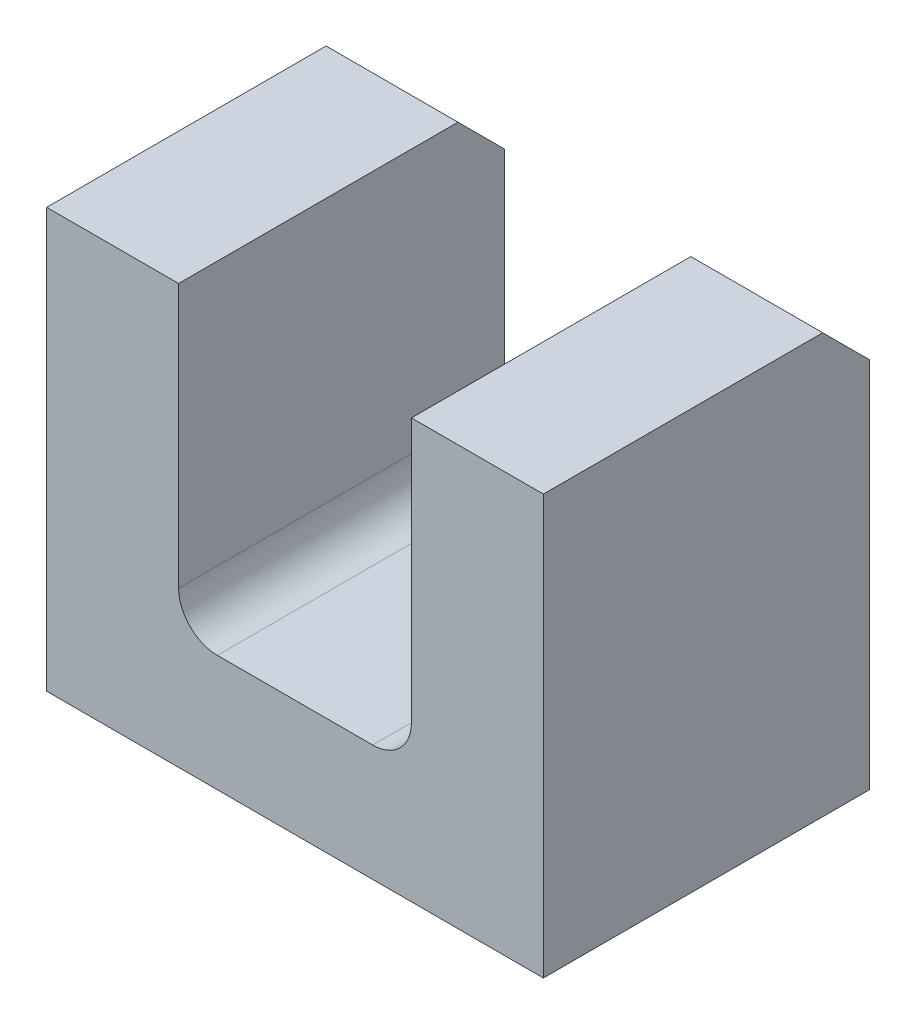
ISO-10303-21;
HEADER;
FILE_DESCRIPTION(('STEP AP214'),'2;1');
FILE_NAME('part.step','',(''),(''),'','','');
FILE_SCHEMA(('AUTOMOTIVE_DESIGN { 1 0 10303 214 1 1 1 1 }'));
ENDSEC;
DATA;
#1=APPLICATION_CONTEXT('core data for automotive mechanical design processes');
#2=APPLICATION_PROTOCOL_DEFINITION('international standard','automotive_design',2000,#1);
#3=PRODUCT_CONTEXT('',#1,'mechanical');
#4=PRODUCT('Part','Part','',(#3));
#5=PRODUCT_RELATED_PRODUCT_CATEGORY('part','',(#4));
#6=PRODUCT_DEFINITION_FORMATION('','',#4);
#7=PRODUCT_DEFINITION_CONTEXT('part definition',#1,'design');
#8=PRODUCT_DEFINITION('design','',#6,#7);
#9=PRODUCT_DEFINITION_SHAPE('','',#8);
#10=(LENGTH_UNIT() NAMED_UNIT(*) SI_UNIT(.MILLI.,.METRE.));
#11=(NAMED_UNIT(*) PLANE_ANGLE_UNIT() SI_UNIT($,.RADIAN.));
#12=(NAMED_UNIT(*) SI_UNIT($,.STERADIAN.) SOLID_ANGLE_UNIT());
#13=UNCERTAINTY_MEASURE_WITH_UNIT(LENGTH_MEASURE(1.E-05),#10,'distance_accuracy_value','');
#14=(GEOMETRIC_REPRESENTATION_CONTEXT(3) GLOBAL_UNCERTAINTY_ASSIGNED_CONTEXT((#13)) GLOBAL_UNIT_ASSIGNED_CONTEXT((#10,
#11,#12)) REPRESENTATION_CONTEXT('',''));
#15=CARTESIAN_POINT('',(0.,0.,0.));
#16=DIRECTION('',(0.,0.,1.));
#17=DIRECTION('',(1.,0.,0.));
#18=AXIS2_PLACEMENT_3D('',#15,#16,#17);
#19=CARTESIAN_POINT('',(0.,5.4,0.));
#20=DIRECTION('',(0.,1.,0.));
#21=DIRECTION('',(0.,0.,1.));
#22=AXIS2_PLACEMENT_3D('',#19,#20,#21);
#23=PLANE('',#22);
#24=DIRECTION('',(0.,0.,1.));
#25=VECTOR('',#24,1.);
#26=CARTESIAN_POINT('',(-1.5,5.4,2.1));
#27=LINE('',#26,#25);
#28=CARTESIAN_POINT('',(-1.5,5.4,-1.5));
#29=VERTEX_POINT('',#28);
#30=CARTESIAN_POINT('',(-1.5,5.4,2.1));
#31=VERTEX_POINT('',#30);
#32=EDGE_CURVE('E118',#29,#31,#27,.T.);
#33=ORIENTED_EDGE('',*,*,#32,.F.);
#34=DIRECTION('',(-1.,0.,0.));
#35=VECTOR('',#34,1.);
#36=CARTESIAN_POINT('',(-3.2,5.4,-1.5));
#37=LINE('',#36,#35);
#38=CARTESIAN_POINT('',(-3.2,5.4,-1.5));
#39=VERTEX_POINT('',#38);
#40=EDGE_CURVE('E196',#29,#39,#37,.T.);
#41=ORIENTED_EDGE('',*,*,#40,.T.);
#42=DIRECTION('',(0.,0.,1.));
#43=VECTOR('',#42,1.);
#44=CARTESIAN_POINT('',(-3.2,5.4,2.1));
#45=LINE('',#44,#43);
#46=CARTESIAN_POINT('',(-3.2,5.4,2.1));
#47=VERTEX_POINT('',#46);
#48=EDGE_CURVE('E139',#39,#47,#45,.T.);
#49=ORIENTED_EDGE('',*,*,#48,.T.);
#50=DIRECTION('',(1.,0.,0.));
#51=VECTOR('',#50,1.);
#52=CARTESIAN_POINT('',(3.2,5.4,2.1));
#53=LINE('',#52,#51);
#54=EDGE_CURVE('E132',#47,#31,#53,.T.);
#55=ORIENTED_EDGE('',*,*,#54,.T.);
#56=EDGE_LOOP('',(#33,#41,#49,#55));
#57=FACE_BOUND('',#56,.T.);
#58=ADVANCED_FACE('F32',(#57),#23,.T.);
#59=CARTESIAN_POINT('',(-3.2,5.4,2.1));
#60=DIRECTION('',(1.,0.,0.));
#61=DIRECTION('',(0.,0.,-1.));
#62=AXIS2_PLACEMENT_3D('',#59,#60,#61);
#63=PLANE('',#62);
#64=ORIENTED_EDGE('',*,*,#48,.F.);
#65=DIRECTION('',(0.,-0.707106781186549,-0.707106781186546));
#66=VECTOR('',#65,1.);
#67=CARTESIAN_POINT('',(-3.2,5.4,-1.5));
#68=LINE('',#67,#66);
#69=CARTESIAN_POINT('',(-3.2,4.8,-2.1));
#70=VERTEX_POINT('',#69);
#71=EDGE_CURVE('E40',#39,#70,#68,.T.);
#72=ORIENTED_EDGE('',*,*,#71,.T.);
#73=DIRECTION('',(0.,-1.,0.));
#74=VECTOR('',#73,1.);
#75=CARTESIAN_POINT('',(-3.2,5.4,-2.1));
#76=LINE('',#75,#74);
#77=CARTESIAN_POINT('',(-3.2,0.,-2.1));
#78=VERTEX_POINT('',#77);
#79=EDGE_CURVE('E144',#70,#78,#76,.T.);
#80=ORIENTED_EDGE('',*,*,#79,.T.);
#81=DIRECTION('',(0.,0.,1.));
#82=VECTOR('',#81,1.);
#83=CARTESIAN_POINT('',(-3.2,0.,2.1));
#84=LINE('',#83,#82);
#85=CARTESIAN_POINT('',(-3.2,0.,2.1));
#86=VERTEX_POINT('',#85);
#87=EDGE_CURVE('E148',#78,#86,#84,.T.);
#88=ORIENTED_EDGE('',*,*,#87,.T.);
#89=DIRECTION('',(0.,-1.,0.));
#90=VECTOR('',#89,1.);
#91=CARTESIAN_POINT('',(-3.2,5.4,2.1));
#92=LINE('',#91,#90);
#93=EDGE_CURVE('E166',#47,#86,#92,.T.);
#94=ORIENTED_EDGE('',*,*,#93,.F.);
#95=EDGE_LOOP('',(#64,#72,#80,#88,#94));
#96=FACE_BOUND('',#95,.T.);
#97=ADVANCED_FACE('F199',(#96),#63,.F.);
#98=CARTESIAN_POINT('',(3.2,5.4,2.1));
#99=DIRECTION('',(0.,0.,-1.));
#100=DIRECTION('',(-1.,0.,0.));
#101=AXIS2_PLACEMENT_3D('',#98,#99,#100);
#102=PLANE('',#101);
#103=DIRECTION('',(1.,0.,0.));
#104=VECTOR('',#103,1.);
#105=CARTESIAN_POINT('',(1.5,1.5,2.1));
#106=LINE('',#105,#104);
#107=CARTESIAN_POINT('',(-1.,1.5,2.1));
#108=VERTEX_POINT('',#107);
#109=CARTESIAN_POINT('',(1.,1.5,2.1));
#110=VERTEX_POINT('',#109);
#111=EDGE_CURVE('E252',#108,#110,#106,.T.);
#112=ORIENTED_EDGE('',*,*,#111,.F.);
#113=CARTESIAN_POINT('',(-1.,2.,2.1));
#114=DIRECTION('',(0.,0.,-1.));
#115=DIRECTION('',(-1.,0.,0.));
#116=AXIS2_PLACEMENT_3D('',#113,#114,#115);
#117=CIRCLE('',#116,0.5);
#118=CARTESIAN_POINT('',(-1.5,2.,2.1));
#119=VERTEX_POINT('',#118);
#120=EDGE_CURVE('E134',#108,#119,#117,.T.);
#121=ORIENTED_EDGE('',*,*,#120,.T.);
#122=DIRECTION('',(0.,1.,0.));
#123=VECTOR('',#122,1.);
#124=CARTESIAN_POINT('',(-1.5,1.5,2.1));
#125=LINE('',#124,#123);
#126=EDGE_CURVE('E121',#119,#31,#125,.T.);
#127=ORIENTED_EDGE('',*,*,#126,.T.);
#128=ORIENTED_EDGE('',*,*,#54,.F.);
#129=ORIENTED_EDGE('',*,*,#93,.T.);
#130=DIRECTION('',(1.,0.,0.));
#131=VECTOR('',#130,1.);
#132=CARTESIAN_POINT('',(3.2,0.,2.1));
#133=LINE('',#132,#131);
#134=CARTESIAN_POINT('',(3.2,0.,2.1));
#135=VERTEX_POINT('',#134);
#136=EDGE_CURVE('E151',#86,#135,#133,.T.);
#137=ORIENTED_EDGE('',*,*,#136,.T.);
#138=DIRECTION('',(0.,-1.,0.));
#139=VECTOR('',#138,1.);
#140=CARTESIAN_POINT('',(3.2,5.4,2.1));
#141=LINE('',#140,#139);
#142=CARTESIAN_POINT('',(3.2,5.4,2.1));
#143=VERTEX_POINT('',#142);
#144=EDGE_CURVE('E163',#143,#135,#141,.T.);
#145=ORIENTED_EDGE('',*,*,#144,.F.);
#146=CARTESIAN_POINT('',(1.5,5.4,2.1));
#147=VERTEX_POINT('',#146);
#148=EDGE_CURVE('E141',#147,#143,#53,.T.);
#149=ORIENTED_EDGE('',*,*,#148,.F.);
#150=DIRECTION('',(0.,1.,0.));
#151=VECTOR('',#150,1.);
#152=CARTESIAN_POINT('',(1.5,1.5,2.1));
#153=LINE('',#152,#151);
#154=CARTESIAN_POINT('',(1.5,2.,2.1));
#155=VERTEX_POINT('',#154);
#156=EDGE_CURVE('E135',#155,#147,#153,.T.);
#157=ORIENTED_EDGE('',*,*,#156,.F.);
#158=CARTESIAN_POINT('',(1.,2.,2.1));
#159=DIRECTION('',(0.,0.,-1.));
#160=DIRECTION('',(-1.,0.,0.));
#161=AXIS2_PLACEMENT_3D('',#158,#159,#160);
#162=CIRCLE('',#161,0.5);
#163=EDGE_CURVE('E180',#155,#110,#162,.T.);
#164=ORIENTED_EDGE('',*,*,#163,.T.);
#165=EDGE_LOOP('',(#112,#121,#127,#128,#129,#137,#145,#149,#157,#164));
#166=FACE_BOUND('',#165,.T.);
#167=ADVANCED_FACE('F130',(#166),#102,.F.);
#168=CARTESIAN_POINT('',(3.2,5.4,2.1));
#169=DIRECTION('',(-1.,0.,0.));
#170=DIRECTION('',(0.,0.,1.));
#171=AXIS2_PLACEMENT_3D('',#168,#169,#170);
#172=PLANE('',#171);
#173=DIRECTION('',(0.,-1.,0.));
#174=VECTOR('',#173,1.);
#175=CARTESIAN_POINT('',(3.2,5.4,-2.1));
#176=LINE('',#175,#174);
#177=CARTESIAN_POINT('',(3.2,4.8,-2.1));
#178=VERTEX_POINT('',#177);
#179=CARTESIAN_POINT('',(3.2,0.,-2.1));
#180=VERTEX_POINT('',#179);
#181=EDGE_CURVE('E161',#178,#180,#176,.T.);
#182=ORIENTED_EDGE('',*,*,#181,.F.);
#183=DIRECTION('',(0.,0.707106781186549,0.707106781186547));
#184=VECTOR('',#183,1.);
#185=CARTESIAN_POINT('',(3.2,5.4,-1.5));
#186=LINE('',#185,#184);
#187=CARTESIAN_POINT('',(3.2,5.4,-1.5));
#188=VERTEX_POINT('',#187);
#189=EDGE_CURVE('E194',#178,#188,#186,.T.);
#190=ORIENTED_EDGE('',*,*,#189,.T.);
#191=DIRECTION('',(0.,0.,-1.));
#192=VECTOR('',#191,1.);
#193=CARTESIAN_POINT('',(3.2,5.4,2.1));
#194=LINE('',#193,#192);
#195=EDGE_CURVE('E140',#143,#188,#194,.T.);
#196=ORIENTED_EDGE('',*,*,#195,.F.);
#197=ORIENTED_EDGE('',*,*,#144,.T.);
#198=DIRECTION('',(0.,0.,-1.));
#199=VECTOR('',#198,1.);
#200=CARTESIAN_POINT('',(3.2,0.,2.1));
#201=LINE('',#200,#199);
#202=EDGE_CURVE('E154',#135,#180,#201,.T.);
#203=ORIENTED_EDGE('',*,*,#202,.T.);
#204=EDGE_LOOP('',(#182,#190,#196,#197,#203));
#205=FACE_BOUND('',#204,.T.);
#206=ADVANCED_FACE('F230',(#205),#172,.F.);
#207=CARTESIAN_POINT('',(3.2,5.4,-2.1));
#208=DIRECTION('',(0.,0.,1.));
#209=DIRECTION('',(1.,0.,0.));
#210=AXIS2_PLACEMENT_3D('',#207,#208,#209);
#211=PLANE('',#210);
#212=DIRECTION('',(0.,1.,0.));
#213=VECTOR('',#212,1.);
#214=CARTESIAN_POINT('',(1.5,1.5,-2.1));
#215=LINE('',#214,#213);
#216=CARTESIAN_POINT('',(1.5,2.,-2.1));
#217=VERTEX_POINT('',#216);
#218=CARTESIAN_POINT('',(1.5,4.8,-2.1));
#219=VERTEX_POINT('',#218);
#220=EDGE_CURVE('E244',#217,#219,#215,.T.);
#221=ORIENTED_EDGE('',*,*,#220,.T.);
#222=DIRECTION('',(1.,0.,0.));
#223=VECTOR('',#222,1.);
#224=CARTESIAN_POINT('',(3.2,4.8,-2.1));
#225=LINE('',#224,#223);
#226=EDGE_CURVE('E192',#219,#178,#225,.T.);
#227=ORIENTED_EDGE('',*,*,#226,.T.);
#228=ORIENTED_EDGE('',*,*,#181,.T.);
#229=DIRECTION('',(-1.,0.,0.));
#230=VECTOR('',#229,1.);
#231=CARTESIAN_POINT('',(3.2,0.,-2.1));
#232=LINE('',#231,#230);
#233=EDGE_CURVE('E157',#180,#78,#232,.T.);
#234=ORIENTED_EDGE('',*,*,#233,.T.);
#235=ORIENTED_EDGE('',*,*,#79,.F.);
#236=DIRECTION('',(1.,0.,0.));
#237=VECTOR('',#236,1.);
#238=CARTESIAN_POINT('',(-1.5,4.8,-2.1));
#239=LINE('',#238,#237);
#240=CARTESIAN_POINT('',(-1.5,4.8,-2.1));
#241=VERTEX_POINT('',#240);
#242=EDGE_CURVE('E190',#70,#241,#239,.T.);
#243=ORIENTED_EDGE('',*,*,#242,.T.);
#244=DIRECTION('',(0.,1.,0.));
#245=VECTOR('',#244,1.);
#246=CARTESIAN_POINT('',(-1.5,1.5,-2.1));
#247=LINE('',#246,#245);
#248=CARTESIAN_POINT('',(-1.5,2.,-2.1));
#249=VERTEX_POINT('',#248);
#250=EDGE_CURVE('E152',#249,#241,#247,.T.);
#251=ORIENTED_EDGE('',*,*,#250,.F.);
#252=CARTESIAN_POINT('',(-1.,2.,-2.1));
#253=DIRECTION('',(0.,0.,1.));
#254=DIRECTION('',(1.,0.,0.));
#255=AXIS2_PLACEMENT_3D('',#252,#253,#254);
#256=CIRCLE('',#255,0.5);
#257=CARTESIAN_POINT('',(-1.,1.5,-2.1));
#258=VERTEX_POINT('',#257);
#259=EDGE_CURVE('E183',#249,#258,#256,.T.);
#260=ORIENTED_EDGE('',*,*,#259,.T.);
#261=DIRECTION('',(-1.,0.,0.));
#262=VECTOR('',#261,1.);
#263=CARTESIAN_POINT('',(1.5,1.5,-2.1));
#264=LINE('',#263,#262);
#265=CARTESIAN_POINT('',(1.,1.5,-2.1));
#266=VERTEX_POINT('',#265);
#267=EDGE_CURVE('E136',#266,#258,#264,.T.);
#268=ORIENTED_EDGE('',*,*,#267,.F.);
#269=CARTESIAN_POINT('',(1.,2.,-2.1));
#270=DIRECTION('',(0.,0.,1.));
#271=DIRECTION('',(1.,0.,0.));
#272=AXIS2_PLACEMENT_3D('',#269,#270,#271);
#273=CIRCLE('',#272,0.5);
#274=EDGE_CURVE('E178',#266,#217,#273,.T.);
#275=ORIENTED_EDGE('',*,*,#274,.T.);
#276=EDGE_LOOP('',(#221,#227,#228,#234,#235,#243,#251,#260,#268,#275));
#277=FACE_BOUND('',#276,.T.);
#278=ADVANCED_FACE('F202',(#277),#211,.F.);
#279=ORIENTED_EDGE('',*,*,#195,.T.);
#280=DIRECTION('',(-1.,0.,0.));
#281=VECTOR('',#280,1.);
#282=CARTESIAN_POINT('',(1.5,5.4,-1.5));
#283=LINE('',#282,#281);
#284=CARTESIAN_POINT('',(1.5,5.4,-1.5));
#285=VERTEX_POINT('',#284);
#286=EDGE_CURVE('E185',#188,#285,#283,.T.);
#287=ORIENTED_EDGE('',*,*,#286,.T.);
#288=DIRECTION('',(0.,0.,-1.));
#289=VECTOR('',#288,1.);
#290=CARTESIAN_POINT('',(1.5,5.4,2.1));
#291=LINE('',#290,#289);
#292=EDGE_CURVE('E125',#147,#285,#291,.T.);
#293=ORIENTED_EDGE('',*,*,#292,.F.);
#294=ORIENTED_EDGE('',*,*,#148,.T.);
#295=EDGE_LOOP('',(#279,#287,#293,#294));
#296=FACE_BOUND('',#295,.T.);
#297=ADVANCED_FACE('F215',(#296),#23,.T.);
#298=CARTESIAN_POINT('',(0.,0.,0.));
#299=DIRECTION('',(0.,1.,0.));
#300=DIRECTION('',(0.,0.,1.));
#301=AXIS2_PLACEMENT_3D('',#298,#299,#300);
#302=PLANE('',#301);
#303=ORIENTED_EDGE('',*,*,#87,.F.);
#304=ORIENTED_EDGE('',*,*,#233,.F.);
#305=ORIENTED_EDGE('',*,*,#202,.F.);
#306=ORIENTED_EDGE('',*,*,#136,.F.);
#307=EDGE_LOOP('',(#303,#304,#305,#306));
#308=FACE_BOUND('',#307,.T.);
#309=ADVANCED_FACE('F223',(#308),#302,.F.);
#310=CARTESIAN_POINT('',(-1.5,1.5,2.1));
#311=DIRECTION('',(-1.,0.,0.));
#312=DIRECTION('',(0.,0.,1.));
#313=AXIS2_PLACEMENT_3D('',#310,#311,#312);
#314=PLANE('',#313);
#315=ORIENTED_EDGE('',*,*,#250,.T.);
#316=DIRECTION('',(0.,0.707106781186549,0.707106781186546));
#317=VECTOR('',#316,1.);
#318=CARTESIAN_POINT('',(-1.5,5.4,-1.5));
#319=LINE('',#318,#317);
#320=EDGE_CURVE('E11',#241,#29,#319,.T.);
#321=ORIENTED_EDGE('',*,*,#320,.T.);
#322=ORIENTED_EDGE('',*,*,#32,.T.);
#323=ORIENTED_EDGE('',*,*,#126,.F.);
#324=DIRECTION('',(0.,0.,1.));
#325=VECTOR('',#324,1.);
#326=CARTESIAN_POINT('',(-1.5,2.,2.1));
#327=LINE('',#326,#325);
#328=EDGE_CURVE('E176',#119,#249,#327,.F.);
#329=ORIENTED_EDGE('',*,*,#328,.T.);
#330=EDGE_LOOP('',(#315,#321,#322,#323,#329));
#331=FACE_BOUND('',#330,.T.);
#332=ADVANCED_FACE('F120',(#331),#314,.F.);
#333=CARTESIAN_POINT('',(1.5,1.5,2.1));
#334=DIRECTION('',(1.,0.,0.));
#335=DIRECTION('',(0.,0.,-1.));
#336=AXIS2_PLACEMENT_3D('',#333,#334,#335);
#337=PLANE('',#336);
#338=ORIENTED_EDGE('',*,*,#292,.T.);
#339=DIRECTION('',(0.,-0.707106781186549,-0.707106781186547));
#340=VECTOR('',#339,1.);
#341=CARTESIAN_POINT('',(1.5,5.4,-1.5));
#342=LINE('',#341,#340);
#343=EDGE_CURVE('E188',#285,#219,#342,.T.);
#344=ORIENTED_EDGE('',*,*,#343,.T.);
#345=ORIENTED_EDGE('',*,*,#220,.F.);
#346=DIRECTION('',(0.,0.,-1.));
#347=VECTOR('',#346,1.);
#348=CARTESIAN_POINT('',(1.5,2.,2.1));
#349=LINE('',#348,#347);
#350=EDGE_CURVE('E174',#217,#155,#349,.F.);
#351=ORIENTED_EDGE('',*,*,#350,.T.);
#352=ORIENTED_EDGE('',*,*,#156,.T.);
#353=EDGE_LOOP('',(#338,#344,#345,#351,#352));
#354=FACE_BOUND('',#353,.T.);
#355=ADVANCED_FACE('F243',(#354),#337,.F.);
#356=CARTESIAN_POINT('',(0.,1.5,0.));
#357=DIRECTION('',(0.,1.,0.));
#358=DIRECTION('',(0.,0.,1.));
#359=AXIS2_PLACEMENT_3D('',#356,#357,#358);
#360=PLANE('',#359);
#361=ORIENTED_EDGE('',*,*,#111,.T.);
#362=DIRECTION('',(0.,0.,-1.));
#363=VECTOR('',#362,1.);
#364=CARTESIAN_POINT('',(1.,1.5,0.));
#365=LINE('',#364,#363);
#366=EDGE_CURVE('E171',#110,#266,#365,.T.);
#367=ORIENTED_EDGE('',*,*,#366,.T.);
#368=ORIENTED_EDGE('',*,*,#267,.T.);
#369=DIRECTION('',(0.,0.,1.));
#370=VECTOR('',#369,1.);
#371=CARTESIAN_POINT('',(-1.,1.5,0.));
#372=LINE('',#371,#370);
#373=EDGE_CURVE('E168',#258,#108,#372,.T.);
#374=ORIENTED_EDGE('',*,*,#373,.T.);
#375=EDGE_LOOP('',(#361,#367,#368,#374));
#376=FACE_BOUND('',#375,.T.);
#377=ADVANCED_FACE('F259',(#376),#360,.T.);
#378=CARTESIAN_POINT('',(1.,2.,0.));
#379=DIRECTION('',(0.,0.,-1.));
#380=DIRECTION('',(-1.,0.,0.));
#381=AXIS2_PLACEMENT_3D('',#378,#379,#380);
#382=CYLINDRICAL_SURFACE('',#381,0.5);
#383=ORIENTED_EDGE('',*,*,#163,.F.);
#384=ORIENTED_EDGE('',*,*,#350,.F.);
#385=ORIENTED_EDGE('',*,*,#274,.F.);
#386=ORIENTED_EDGE('',*,*,#366,.F.);
#387=EDGE_LOOP('',(#383,#384,#385,#386));
#388=FACE_BOUND('',#387,.T.);
#389=ADVANCED_FACE('F263',(#388),#382,.F.);
#390=CARTESIAN_POINT('',(-1.,2.,0.));
#391=DIRECTION('',(0.,0.,1.));
#392=DIRECTION('',(1.,0.,0.));
#393=AXIS2_PLACEMENT_3D('',#390,#391,#392);
#394=CYLINDRICAL_SURFACE('',#393,0.5);
#395=ORIENTED_EDGE('',*,*,#259,.F.);
#396=ORIENTED_EDGE('',*,*,#328,.F.);
#397=ORIENTED_EDGE('',*,*,#120,.F.);
#398=ORIENTED_EDGE('',*,*,#373,.F.);
#399=EDGE_LOOP('',(#395,#396,#397,#398));
#400=FACE_BOUND('',#399,.T.);
#401=ADVANCED_FACE('F211',(#400),#394,.F.);
#402=CARTESIAN_POINT('',(0.,5.4,-1.5));
#403=DIRECTION('',(0.,0.707106781186547,-0.707106781186549));
#404=DIRECTION('',(1.,0.,0.));
#405=AXIS2_PLACEMENT_3D('',#402,#403,#404);
#406=PLANE('',#405);
#407=ORIENTED_EDGE('',*,*,#189,.F.);
#408=ORIENTED_EDGE('',*,*,#226,.F.);
#409=ORIENTED_EDGE('',*,*,#343,.F.);
#410=ORIENTED_EDGE('',*,*,#286,.F.);
#411=EDGE_LOOP('',(#407,#408,#409,#410));
#412=FACE_BOUND('',#411,.T.);
#413=ADVANCED_FACE('F207',(#412),#406,.T.);
#414=CARTESIAN_POINT('',(0.,5.4,-1.5));
#415=DIRECTION('',(0.,0.707106781186546,-0.707106781186549));
#416=DIRECTION('',(1.,0.,0.));
#417=AXIS2_PLACEMENT_3D('',#414,#415,#416);
#418=PLANE('',#417);
#419=ORIENTED_EDGE('',*,*,#320,.F.);
#420=ORIENTED_EDGE('',*,*,#242,.F.);
#421=ORIENTED_EDGE('',*,*,#71,.F.);
#422=ORIENTED_EDGE('',*,*,#40,.F.);
#423=EDGE_LOOP('',(#419,#420,#421,#422));
#424=FACE_BOUND('',#423,.T.);
#425=ADVANCED_FACE('F34',(#424),#418,.T.);
#426=CLOSED_SHELL('',(#58,#97,#167,#206,#278,#297,#309,#332,#355,#377,#389,#401,#413,#425));
#427=MANIFOLD_SOLID_BREP('B2',#426);
#428=ADVANCED_BREP_SHAPE_REPRESENTATION('',(#18,#427),#14);
#429=SHAPE_DEFINITION_REPRESENTATION(#9,#428);
ENDSEC;
END-ISO-10303-21;
